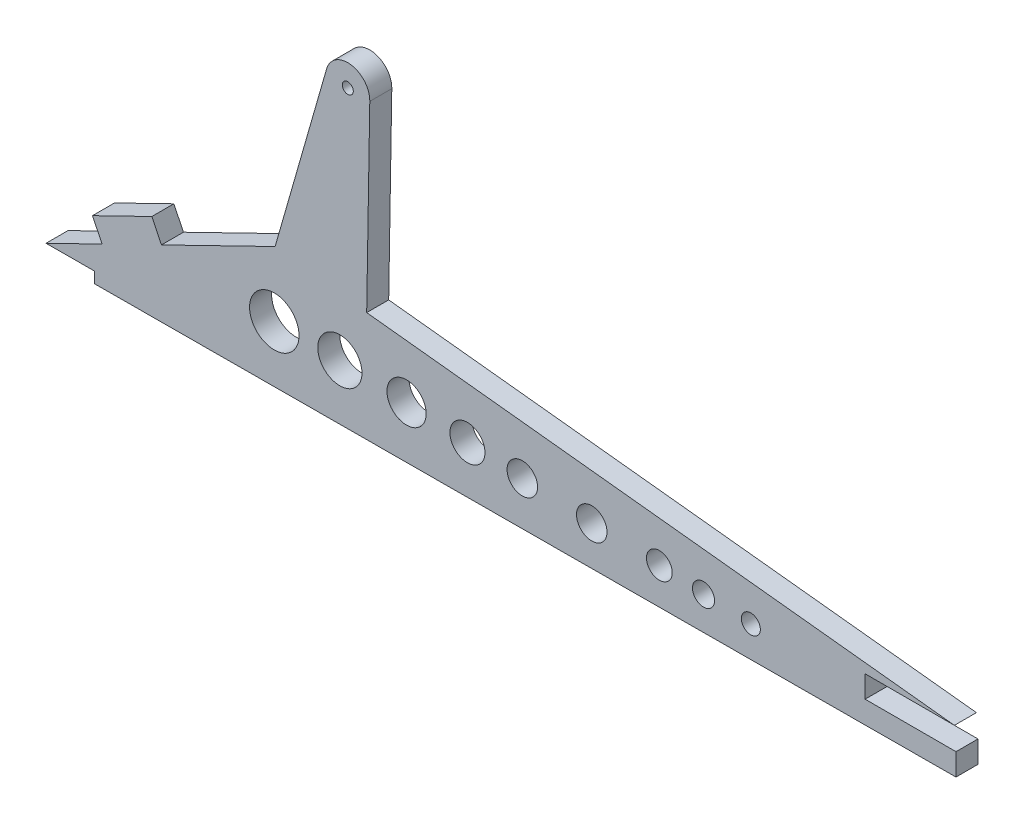
ISO-10303-21;
HEADER;
FILE_DESCRIPTION(('STEP AP214'),'2;1');
FILE_NAME('part.step','',(''),(''),'','','');
FILE_SCHEMA(('AUTOMOTIVE_DESIGN { 1 0 10303 214 1 1 1 1 }'));
ENDSEC;
DATA;
#1=APPLICATION_CONTEXT('core data for automotive mechanical design processes');
#2=APPLICATION_PROTOCOL_DEFINITION('international standard','automotive_design',2000,#1);
#3=PRODUCT_CONTEXT('',#1,'mechanical');
#4=PRODUCT('Part','Part','',(#3));
#5=PRODUCT_RELATED_PRODUCT_CATEGORY('part','',(#4));
#6=PRODUCT_DEFINITION_FORMATION('','',#4);
#7=PRODUCT_DEFINITION_CONTEXT('part definition',#1,'design');
#8=PRODUCT_DEFINITION('design','',#6,#7);
#9=PRODUCT_DEFINITION_SHAPE('','',#8);
#10=(LENGTH_UNIT() NAMED_UNIT(*) SI_UNIT(.MILLI.,.METRE.));
#11=(NAMED_UNIT(*) PLANE_ANGLE_UNIT() SI_UNIT($,.RADIAN.));
#12=(NAMED_UNIT(*) SI_UNIT($,.STERADIAN.) SOLID_ANGLE_UNIT());
#13=UNCERTAINTY_MEASURE_WITH_UNIT(LENGTH_MEASURE(1.E-05),#10,'distance_accuracy_value','');
#14=(GEOMETRIC_REPRESENTATION_CONTEXT(3) GLOBAL_UNCERTAINTY_ASSIGNED_CONTEXT((#13)) GLOBAL_UNIT_ASSIGNED_CONTEXT((#10,
#11,#12)) REPRESENTATION_CONTEXT('',''));
#15=CARTESIAN_POINT('',(0.,0.,0.));
#16=DIRECTION('',(0.,0.,1.));
#17=DIRECTION('',(1.,0.,0.));
#18=AXIS2_PLACEMENT_3D('',#15,#16,#17);
#19=CARTESIAN_POINT('',(29.3566507065568,29.7232931380651,2.));
#20=DIRECTION('',(0.,0.,1.));
#21=DIRECTION('',(1.,0.,0.));
#22=AXIS2_PLACEMENT_3D('',#19,#20,#21);
#23=PLANE('',#22);
#24=CARTESIAN_POINT('',(22.680090468022,8.02272427840867,2.));
#25=DIRECTION('',(0.,0.,1.));
#26=DIRECTION('',(1.,0.,0.));
#27=AXIS2_PLACEMENT_3D('',#24,#25,#26);
#28=CIRCLE('',#27,2.2462111920011);
#29=CARTESIAN_POINT('',(24.9263016600231,8.02272427840867,2.));
#30=VERTEX_POINT('',#29);
#31=EDGE_CURVE('E436',#30,#30,#28,.T.);
#32=ORIENTED_EDGE('',*,*,#31,.F.);
#33=EDGE_LOOP('',(#32));
#34=FACE_BOUND('',#33,.T.);
#35=CARTESIAN_POINT('',(45.2142943886309,6.94412798213639,2.));
#36=DIRECTION('',(0.,0.,1.));
#37=DIRECTION('',(1.,0.,0.));
#38=AXIS2_PLACEMENT_3D('',#35,#36,#37);
#39=CIRCLE('',#38,1.38676846513165);
#40=CARTESIAN_POINT('',(46.6010628537625,6.94412798213639,2.));
#41=VERTEX_POINT('',#40);
#42=EDGE_CURVE('E452',#41,#41,#39,.T.);
#43=ORIENTED_EDGE('',*,*,#42,.F.);
#44=EDGE_LOOP('',(#43));
#45=FACE_BOUND('',#44,.T.);
#46=CARTESIAN_POINT('',(61.6776183825757,6.04967389246499,2.));
#47=DIRECTION('',(0.,0.,1.));
#48=DIRECTION('',(1.,0.,0.));
#49=AXIS2_PLACEMENT_3D('',#46,#47,#48);
#50=CIRCLE('',#49,1.00599022067139);
#51=CARTESIAN_POINT('',(62.6836086032471,6.04967389246499,2.));
#52=VERTEX_POINT('',#51);
#53=EDGE_CURVE('E468',#52,#52,#50,.T.);
#54=ORIENTED_EDGE('',*,*,#53,.F.);
#55=EDGE_LOOP('',(#54));
#56=FACE_BOUND('',#55,.T.);
#57=CARTESIAN_POINT('',(40.2281960130975,7.26518024586645,2.));
#58=DIRECTION('',(0.,0.,1.));
#59=DIRECTION('',(1.,0.,0.));
#60=AXIS2_PLACEMENT_3D('',#57,#58,#59);
#61=CIRCLE('',#60,1.59060723683747);
#62=CARTESIAN_POINT('',(41.8188032499349,7.26518024586645,2.));
#63=VERTEX_POINT('',#62);
#64=EDGE_CURVE('E484',#63,#63,#61,.T.);
#65=ORIENTED_EDGE('',*,*,#64,.F.);
#66=EDGE_LOOP('',(#65));
#67=FACE_BOUND('',#66,.T.);
#68=CARTESIAN_POINT('',(29.3566507065568,29.7232931380651,2.));
#69=DIRECTION('',(0.,0.,1.));
#70=DIRECTION('',(1.,0.,0.));
#71=AXIS2_PLACEMENT_3D('',#68,#69,#70);
#72=CIRCLE('',#71,0.5);
#73=CARTESIAN_POINT('',(29.8566507065568,29.7232931380651,2.));
#74=VERTEX_POINT('',#73);
#75=EDGE_CURVE('E200',#74,#74,#72,.T.);
#76=ORIENTED_EDGE('',*,*,#75,.F.);
#77=EDGE_LOOP('',(#76));
#78=FACE_BOUND('',#77,.T.);
#79=CARTESIAN_POINT('',(29.3566507065568,29.7232931380651,2.));
#80=DIRECTION('',(0.,0.,1.));
#81=DIRECTION('',(1.,0.,0.));
#82=AXIS2_PLACEMENT_3D('',#79,#80,#81);
#83=CIRCLE('',#82,2.);
#84=CARTESIAN_POINT('',(31.3560328855275,29.6735849655517,2.));
#85=VERTEX_POINT('',#84);
#86=CARTESIAN_POINT('',(27.4299095256646,30.2596404339976,2.));
#87=VERTEX_POINT('',#86);
#88=EDGE_CURVE('E245',#85,#87,#83,.T.);
#89=ORIENTED_EDGE('',*,*,#88,.T.);
#90=DIRECTION('',(-0.275649217594403,-0.961258294549178,0.));
#91=VECTOR('',#90,1.);
#92=CARTESIAN_POINT('',(22.7538009631778,13.9528713412703,2.));
#93=LINE('',#92,#91);
#94=CARTESIAN_POINT('',(22.7538009631778,13.9528713412703,2.));
#95=VERTEX_POINT('',#94);
#96=EDGE_CURVE('E127',#87,#95,#93,.T.);
#97=ORIENTED_EDGE('',*,*,#96,.T.);
#98=DIRECTION('',(-0.898794046299176,-0.438371146789058,0.));
#99=VECTOR('',#98,1.);
#100=CARTESIAN_POINT('',(12.430829765545,8.91802187735826,2.));
#101=LINE('',#100,#99);
#102=CARTESIAN_POINT('',(12.430829765545,8.91802187735826,2.));
#103=VERTEX_POINT('',#102);
#104=EDGE_CURVE('E302',#95,#103,#101,.T.);
#105=ORIENTED_EDGE('',*,*,#104,.T.);
#106=DIRECTION('',(-0.438371146789109,0.898794046299152,0.));
#107=VECTOR('',#106,1.);
#108=CARTESIAN_POINT('',(11.5540874719671,10.7156099699561,2.));
#109=LINE('',#108,#107);
#110=CARTESIAN_POINT('',(11.5540874719671,10.7156099699561,2.));
#111=VERTEX_POINT('',#110);
#112=EDGE_CURVE('E322',#103,#111,#109,.T.);
#113=ORIENTED_EDGE('',*,*,#112,.T.);
#114=DIRECTION('',(-0.898794046299091,-0.438371146789234,0.));
#115=VECTOR('',#114,1.);
#116=CARTESIAN_POINT('',(6.16132319417264,8.08538308922076,2.));
#117=LINE('',#116,#115);
#118=CARTESIAN_POINT('',(6.16132319417264,8.08538308922076,2.));
#119=VERTEX_POINT('',#118);
#120=EDGE_CURVE('E318',#111,#119,#117,.T.);
#121=ORIENTED_EDGE('',*,*,#120,.T.);
#122=DIRECTION('',(0.438371146789109,-0.898794046299152,0.));
#123=VECTOR('',#122,1.);
#124=CARTESIAN_POINT('',(7.03806548775063,6.28779499662292,2.));
#125=LINE('',#124,#123);
#126=CARTESIAN_POINT('',(7.03806548775063,6.28779499662292,2.));
#127=VERTEX_POINT('',#126);
#128=EDGE_CURVE('E321',#119,#127,#125,.T.);
#129=ORIENTED_EDGE('',*,*,#128,.T.);
#130=DIRECTION('',(-0.898794046299245,-0.438371146788918,0.));
#131=VECTOR('',#130,1.);
#132=CARTESIAN_POINT('',(7.03806548775063,6.28779499662292,2.));
#133=LINE('',#132,#131);
#134=CARTESIAN_POINT('',(1.93929674249992,3.8009593180042,2.));
#135=VERTEX_POINT('',#134);
#136=EDGE_CURVE('E326',#127,#135,#133,.T.);
#137=ORIENTED_EDGE('',*,*,#136,.T.);
#138=DIRECTION('',(0.999991711061757,0.00407158541353285,0.));
#139=VECTOR('',#138,1.);
#140=CARTESIAN_POINT('',(1.93929674249992,3.8009593180042,2.));
#141=LINE('',#140,#139);
#142=CARTESIAN_POINT('',(6.36396809005763,3.8189748946526,2.));
#143=VERTEX_POINT('',#142);
#144=EDGE_CURVE('E333',#135,#143,#141,.T.);
#145=ORIENTED_EDGE('',*,*,#144,.T.);
#146=DIRECTION('',(0.00407158541473264,-0.999991711061752,0.));
#147=VECTOR('',#146,1.);
#148=CARTESIAN_POINT('',(6.36803967547237,2.81898318358677,2.));
#149=LINE('',#148,#147);
#150=CARTESIAN_POINT('',(6.36803967547237,2.81898318358677,2.));
#151=VERTEX_POINT('',#150);
#152=EDGE_CURVE('E336',#143,#151,#149,.T.);
#153=ORIENTED_EDGE('',*,*,#152,.T.);
#154=DIRECTION('',(0.999991711061761,0.00407158541259965,0.));
#155=VECTOR('',#154,1.);
#156=CARTESIAN_POINT('',(6.36803967547237,2.81898318358677,2.));
#157=LINE('',#156,#155);
#158=CARTESIAN_POINT('',(39.0801286322619,2.95217435181226,2.));
#159=VERTEX_POINT('',#158);
#160=EDGE_CURVE('E339',#151,#159,#157,.T.);
#161=ORIENTED_EDGE('',*,*,#160,.T.);
#162=DIRECTION('',(0.99999161470575,0.00409518231421341,0.));
#163=VECTOR('',#162,1.);
#164=CARTESIAN_POINT('',(39.0801286322619,2.95217435181226,2.));
#165=LINE('',#164,#163);
#166=CARTESIAN_POINT('',(84.6131730240047,3.138642033504,2.));
#167=VERTEX_POINT('',#166);
#168=EDGE_CURVE('E342',#159,#167,#165,.T.);
#169=ORIENTED_EDGE('',*,*,#168,.T.);
#170=DIRECTION('',(0.,1.,0.));
#171=VECTOR('',#170,1.);
#172=CARTESIAN_POINT('',(84.6131730240047,3.138642033504,2.));
#173=LINE('',#172,#171);
#174=CARTESIAN_POINT('',(84.6131730240047,5.13864203350491,2.));
#175=VERTEX_POINT('',#174);
#176=EDGE_CURVE('E345',#167,#175,#173,.T.);
#177=ORIENTED_EDGE('',*,*,#176,.T.);
#178=DIRECTION('',(-1.,0.,0.));
#179=VECTOR('',#178,1.);
#180=CARTESIAN_POINT('',(76.3569966280118,5.13864203350536,2.));
#181=LINE('',#180,#179);
#182=CARTESIAN_POINT('',(76.3569966280118,5.13864203350536,2.));
#183=VERTEX_POINT('',#182);
#184=EDGE_CURVE('E348',#175,#183,#181,.T.);
#185=ORIENTED_EDGE('',*,*,#184,.T.);
#186=DIRECTION('',(0.,1.,0.));
#187=VECTOR('',#186,1.);
#188=CARTESIAN_POINT('',(76.3569966280118,5.13864203350536,2.));
#189=LINE('',#188,#187);
#190=CARTESIAN_POINT('',(76.3569966280118,7.13864203350491,2.));
#191=VERTEX_POINT('',#190);
#192=EDGE_CURVE('E173',#183,#191,#189,.T.);
#193=ORIENTED_EDGE('',*,*,#192,.T.);
#194=DIRECTION('',(1.,0.,0.));
#195=VECTOR('',#194,1.);
#196=CARTESIAN_POINT('',(76.3569966280118,7.13864203350491,2.));
#197=LINE('',#196,#195);
#198=CARTESIAN_POINT('',(84.4693771304381,7.13864203350536,2.));
#199=VERTEX_POINT('',#198);
#200=EDGE_CURVE('E167',#191,#199,#197,.T.);
#201=ORIENTED_EDGE('',*,*,#200,.T.);
#202=DIRECTION('',(-0.994202761466386,0.107521482005288,0.));
#203=VECTOR('',#202,1.);
#204=CARTESIAN_POINT('',(31.0738545443462,12.9132847355992,2.));
#205=LINE('',#204,#203);
#206=CARTESIAN_POINT('',(31.0738545443462,12.9132847355992,2.));
#207=VERTEX_POINT('',#206);
#208=EDGE_CURVE('E171',#199,#207,#205,.T.);
#209=ORIENTED_EDGE('',*,*,#208,.T.);
#210=DIRECTION('',(0.0168337293134628,0.999858302739644,0.));
#211=VECTOR('',#210,1.);
#212=CARTESIAN_POINT('',(31.3560328855275,29.6735849655517,2.));
#213=LINE('',#212,#211);
#214=EDGE_CURVE('E57',#207,#85,#213,.T.);
#215=ORIENTED_EDGE('',*,*,#214,.T.);
#216=EDGE_LOOP('',(#89,#97,#105,#113,#121,#129,#137,#145,#153,#161,#169,#177,#185,#193,#201,
#209,#215));
#217=FACE_BOUND('',#216,.T.);
#218=CARTESIAN_POINT('',(34.6975794385478,7.65446375504521,2.));
#219=DIRECTION('',(0.,0.,1.));
#220=DIRECTION('',(1.,0.,0.));
#221=AXIS2_PLACEMENT_3D('',#218,#219,#220);
#222=CIRCLE('',#221,1.78299202291938);
#223=CARTESIAN_POINT('',(36.4805714614672,7.65446375504521,2.));
#224=VERTEX_POINT('',#223);
#225=EDGE_CURVE('E492',#224,#224,#222,.T.);
#226=ORIENTED_EDGE('',*,*,#225,.F.);
#227=EDGE_LOOP('',(#226));
#228=FACE_BOUND('',#227,.T.);
#229=CARTESIAN_POINT('',(57.6624037134186,6.32303913357205,2.));
#230=DIRECTION('',(0.,0.,1.));
#231=DIRECTION('',(1.,0.,0.));
#232=AXIS2_PLACEMENT_3D('',#229,#230,#231);
#233=CIRCLE('',#232,1.1683219263401);
#234=CARTESIAN_POINT('',(58.8307256397587,6.32303913357205,2.));
#235=VERTEX_POINT('',#234);
#236=EDGE_CURVE('E476',#235,#235,#233,.T.);
#237=ORIENTED_EDGE('',*,*,#236,.F.);
#238=EDGE_LOOP('',(#237));
#239=FACE_BOUND('',#238,.T.);
#240=CARTESIAN_POINT('',(65.9754176598451,5.87047321346441,2.));
#241=DIRECTION('',(0.,0.,1.));
#242=DIRECTION('',(1.,0.,0.));
#243=AXIS2_PLACEMENT_3D('',#240,#241,#242);
#244=CIRCLE('',#243,0.862372677728845);
#245=CARTESIAN_POINT('',(66.837790337574,5.87047321346441,2.));
#246=VERTEX_POINT('',#245);
#247=EDGE_CURVE('E460',#246,#246,#244,.T.);
#248=ORIENTED_EDGE('',*,*,#247,.F.);
#249=EDGE_LOOP('',(#248));
#250=FACE_BOUND('',#249,.T.);
#251=CARTESIAN_POINT('',(28.6361522127461,7.94352555744459,2.));
#252=DIRECTION('',(0.,0.,1.));
#253=DIRECTION('',(1.,0.,0.));
#254=AXIS2_PLACEMENT_3D('',#251,#252,#253);
#255=CIRCLE('',#254,2.00769198162189);
#256=CARTESIAN_POINT('',(30.643844194368,7.94352555744459,2.));
#257=VERTEX_POINT('',#256);
#258=EDGE_CURVE('E444',#257,#257,#255,.T.);
#259=ORIENTED_EDGE('',*,*,#258,.F.);
#260=EDGE_LOOP('',(#259));
#261=FACE_BOUND('',#260,.T.);
#262=CARTESIAN_POINT('',(51.5237527321467,6.55690835698775,2.));
#263=DIRECTION('',(0.,0.,1.));
#264=DIRECTION('',(1.,0.,0.));
#265=AXIS2_PLACEMENT_3D('',#262,#263,#264);
#266=CIRCLE('',#265,1.38676846513165);
#267=CARTESIAN_POINT('',(52.9105211972784,6.55690835698775,2.));
#268=VERTEX_POINT('',#267);
#269=EDGE_CURVE('E425',#268,#268,#266,.T.);
#270=ORIENTED_EDGE('',*,*,#269,.F.);
#271=EDGE_LOOP('',(#270));
#272=FACE_BOUND('',#271,.T.);
#273=ADVANCED_FACE('F39',(#34,#45,#56,#67,#78,#217,#228,#239,#250,#261,#272),#23,.T.);
#274=CARTESIAN_POINT('',(29.3566507065568,29.7232931380651,0.));
#275=DIRECTION('',(0.,0.,1.));
#276=DIRECTION('',(1.,0.,0.));
#277=AXIS2_PLACEMENT_3D('',#274,#275,#276);
#278=PLANE('',#277);
#279=CARTESIAN_POINT('',(29.3566507065568,29.7232931380651,0.));
#280=DIRECTION('',(0.,0.,1.));
#281=DIRECTION('',(1.,0.,0.));
#282=AXIS2_PLACEMENT_3D('',#279,#280,#281);
#283=CIRCLE('',#282,2.);
#284=CARTESIAN_POINT('',(31.3560328855275,29.6735849655517,0.));
#285=VERTEX_POINT('',#284);
#286=CARTESIAN_POINT('',(27.4299095256646,30.2596404339976,0.));
#287=VERTEX_POINT('',#286);
#288=EDGE_CURVE('E195',#285,#287,#283,.T.);
#289=ORIENTED_EDGE('',*,*,#288,.F.);
#290=DIRECTION('',(0.0168337293134628,0.999858302739644,0.));
#291=VECTOR('',#290,1.);
#292=CARTESIAN_POINT('',(31.3560328855275,29.6735849655517,0.));
#293=LINE('',#292,#291);
#294=CARTESIAN_POINT('',(31.0738545443462,12.9132847355992,0.));
#295=VERTEX_POINT('',#294);
#296=EDGE_CURVE('E119',#295,#285,#293,.T.);
#297=ORIENTED_EDGE('',*,*,#296,.F.);
#298=DIRECTION('',(-0.994202761466386,0.107521482005288,0.));
#299=VECTOR('',#298,1.);
#300=CARTESIAN_POINT('',(31.0738545443462,12.9132847355992,0.));
#301=LINE('',#300,#299);
#302=CARTESIAN_POINT('',(84.4693771304381,7.13864203350536,0.));
#303=VERTEX_POINT('',#302);
#304=EDGE_CURVE('E113',#303,#295,#301,.T.);
#305=ORIENTED_EDGE('',*,*,#304,.F.);
#306=DIRECTION('',(1.,0.,0.));
#307=VECTOR('',#306,1.);
#308=CARTESIAN_POINT('',(76.3569966280118,7.13864203350491,0.));
#309=LINE('',#308,#307);
#310=CARTESIAN_POINT('',(76.3569966280118,7.13864203350491,0.));
#311=VERTEX_POINT('',#310);
#312=EDGE_CURVE('E182',#311,#303,#309,.T.);
#313=ORIENTED_EDGE('',*,*,#312,.F.);
#314=DIRECTION('',(0.,1.,0.));
#315=VECTOR('',#314,1.);
#316=CARTESIAN_POINT('',(76.3569966280118,5.13864203350536,0.));
#317=LINE('',#316,#315);
#318=CARTESIAN_POINT('',(76.3569966280118,5.13864203350536,0.));
#319=VERTEX_POINT('',#318);
#320=EDGE_CURVE('E236',#319,#311,#317,.T.);
#321=ORIENTED_EDGE('',*,*,#320,.F.);
#322=DIRECTION('',(-1.,0.,0.));
#323=VECTOR('',#322,1.);
#324=CARTESIAN_POINT('',(76.3569966280118,5.13864203350536,0.));
#325=LINE('',#324,#323);
#326=CARTESIAN_POINT('',(84.6131730240047,5.13864203350491,0.));
#327=VERTEX_POINT('',#326);
#328=EDGE_CURVE('E233',#327,#319,#325,.T.);
#329=ORIENTED_EDGE('',*,*,#328,.F.);
#330=DIRECTION('',(0.,1.,0.));
#331=VECTOR('',#330,1.);
#332=CARTESIAN_POINT('',(84.6131730240047,3.138642033504,0.));
#333=LINE('',#332,#331);
#334=CARTESIAN_POINT('',(84.6131730240047,3.138642033504,0.));
#335=VERTEX_POINT('',#334);
#336=EDGE_CURVE('E230',#335,#327,#333,.T.);
#337=ORIENTED_EDGE('',*,*,#336,.F.);
#338=DIRECTION('',(0.99999161470575,0.00409518231421341,0.));
#339=VECTOR('',#338,1.);
#340=CARTESIAN_POINT('',(39.0801286322619,2.95217435181226,0.));
#341=LINE('',#340,#339);
#342=CARTESIAN_POINT('',(39.0801286322619,2.95217435181226,0.));
#343=VERTEX_POINT('',#342);
#344=EDGE_CURVE('E227',#343,#335,#341,.T.);
#345=ORIENTED_EDGE('',*,*,#344,.F.);
#346=DIRECTION('',(0.999991711061761,0.00407158541259965,0.));
#347=VECTOR('',#346,1.);
#348=CARTESIAN_POINT('',(6.36803967547237,2.81898318358677,0.));
#349=LINE('',#348,#347);
#350=CARTESIAN_POINT('',(6.36803967547237,2.81898318358677,0.));
#351=VERTEX_POINT('',#350);
#352=EDGE_CURVE('E224',#351,#343,#349,.T.);
#353=ORIENTED_EDGE('',*,*,#352,.F.);
#354=DIRECTION('',(0.00407158541473264,-0.999991711061752,0.));
#355=VECTOR('',#354,1.);
#356=CARTESIAN_POINT('',(6.36803967547237,2.81898318358677,0.));
#357=LINE('',#356,#355);
#358=CARTESIAN_POINT('',(6.36396809005763,3.8189748946526,0.));
#359=VERTEX_POINT('',#358);
#360=EDGE_CURVE('E221',#359,#351,#357,.T.);
#361=ORIENTED_EDGE('',*,*,#360,.F.);
#362=DIRECTION('',(0.999991711061757,0.00407158541353285,0.));
#363=VECTOR('',#362,1.);
#364=CARTESIAN_POINT('',(1.93929674249992,3.8009593180042,0.));
#365=LINE('',#364,#363);
#366=CARTESIAN_POINT('',(1.93929674249992,3.8009593180042,0.));
#367=VERTEX_POINT('',#366);
#368=EDGE_CURVE('E218',#367,#359,#365,.T.);
#369=ORIENTED_EDGE('',*,*,#368,.F.);
#370=DIRECTION('',(-0.898794046299245,-0.438371146788918,0.));
#371=VECTOR('',#370,1.);
#372=CARTESIAN_POINT('',(7.03806548775063,6.28779499662292,0.));
#373=LINE('',#372,#371);
#374=CARTESIAN_POINT('',(7.03806548775063,6.28779499662292,0.));
#375=VERTEX_POINT('',#374);
#376=EDGE_CURVE('E215',#375,#367,#373,.T.);
#377=ORIENTED_EDGE('',*,*,#376,.F.);
#378=DIRECTION('',(0.438371146789109,-0.898794046299152,0.));
#379=VECTOR('',#378,1.);
#380=CARTESIAN_POINT('',(7.03806548775063,6.28779499662292,0.));
#381=LINE('',#380,#379);
#382=CARTESIAN_POINT('',(6.16132319417264,8.08538308922076,0.));
#383=VERTEX_POINT('',#382);
#384=EDGE_CURVE('E212',#383,#375,#381,.T.);
#385=ORIENTED_EDGE('',*,*,#384,.F.);
#386=DIRECTION('',(-0.898794046299091,-0.438371146789234,0.));
#387=VECTOR('',#386,1.);
#388=CARTESIAN_POINT('',(6.16132319417264,8.08538308922076,0.));
#389=LINE('',#388,#387);
#390=CARTESIAN_POINT('',(11.5540874719671,10.7156099699561,0.));
#391=VERTEX_POINT('',#390);
#392=EDGE_CURVE('E209',#391,#383,#389,.T.);
#393=ORIENTED_EDGE('',*,*,#392,.F.);
#394=DIRECTION('',(-0.438371146789109,0.898794046299152,0.));
#395=VECTOR('',#394,1.);
#396=CARTESIAN_POINT('',(11.5540874719671,10.7156099699561,0.));
#397=LINE('',#396,#395);
#398=CARTESIAN_POINT('',(12.430829765545,8.91802187735826,0.));
#399=VERTEX_POINT('',#398);
#400=EDGE_CURVE('E206',#399,#391,#397,.T.);
#401=ORIENTED_EDGE('',*,*,#400,.F.);
#402=DIRECTION('',(-0.898794046299176,-0.438371146789058,0.));
#403=VECTOR('',#402,1.);
#404=CARTESIAN_POINT('',(12.430829765545,8.91802187735826,0.));
#405=LINE('',#404,#403);
#406=CARTESIAN_POINT('',(22.7538009631778,13.9528713412703,0.));
#407=VERTEX_POINT('',#406);
#408=EDGE_CURVE('E203',#407,#399,#405,.T.);
#409=ORIENTED_EDGE('',*,*,#408,.F.);
#410=DIRECTION('',(-0.275649217594403,-0.961258294549178,0.));
#411=VECTOR('',#410,1.);
#412=CARTESIAN_POINT('',(22.7538009631778,13.9528713412703,0.));
#413=LINE('',#412,#411);
#414=EDGE_CURVE('E199',#287,#407,#413,.T.);
#415=ORIENTED_EDGE('',*,*,#414,.F.);
#416=EDGE_LOOP('',(#289,#297,#305,#313,#321,#329,#337,#345,#353,#361,#369,#377,#385,#393,#401,
#409,#415));
#417=FACE_BOUND('',#416,.T.);
#418=CARTESIAN_POINT('',(29.3566507065568,29.7232931380651,0.));
#419=DIRECTION('',(0.,0.,1.));
#420=DIRECTION('',(1.,0.,0.));
#421=AXIS2_PLACEMENT_3D('',#418,#419,#420);
#422=CIRCLE('',#421,0.5);
#423=CARTESIAN_POINT('',(29.8566507065568,29.7232931380651,0.));
#424=VERTEX_POINT('',#423);
#425=EDGE_CURVE('E496',#424,#424,#422,.T.);
#426=ORIENTED_EDGE('',*,*,#425,.T.);
#427=EDGE_LOOP('',(#426));
#428=FACE_BOUND('',#427,.T.);
#429=CARTESIAN_POINT('',(34.6975794385478,7.65446375504521,0.));
#430=DIRECTION('',(0.,0.,1.));
#431=DIRECTION('',(1.,0.,0.));
#432=AXIS2_PLACEMENT_3D('',#429,#430,#431);
#433=CIRCLE('',#432,1.78299202291938);
#434=CARTESIAN_POINT('',(36.4805714614672,7.65446375504521,0.));
#435=VERTEX_POINT('',#434);
#436=EDGE_CURVE('E488',#435,#435,#433,.T.);
#437=ORIENTED_EDGE('',*,*,#436,.T.);
#438=EDGE_LOOP('',(#437));
#439=FACE_BOUND('',#438,.T.);
#440=CARTESIAN_POINT('',(40.2281960130975,7.26518024586645,0.));
#441=DIRECTION('',(0.,0.,1.));
#442=DIRECTION('',(1.,0.,0.));
#443=AXIS2_PLACEMENT_3D('',#440,#441,#442);
#444=CIRCLE('',#443,1.59060723683747);
#445=CARTESIAN_POINT('',(41.8188032499349,7.26518024586645,0.));
#446=VERTEX_POINT('',#445);
#447=EDGE_CURVE('E480',#446,#446,#444,.T.);
#448=ORIENTED_EDGE('',*,*,#447,.T.);
#449=EDGE_LOOP('',(#448));
#450=FACE_BOUND('',#449,.T.);
#451=CARTESIAN_POINT('',(57.6624037134186,6.32303913357205,0.));
#452=DIRECTION('',(0.,0.,1.));
#453=DIRECTION('',(1.,0.,0.));
#454=AXIS2_PLACEMENT_3D('',#451,#452,#453);
#455=CIRCLE('',#454,1.1683219263401);
#456=CARTESIAN_POINT('',(58.8307256397587,6.32303913357205,0.));
#457=VERTEX_POINT('',#456);
#458=EDGE_CURVE('E472',#457,#457,#455,.T.);
#459=ORIENTED_EDGE('',*,*,#458,.T.);
#460=EDGE_LOOP('',(#459));
#461=FACE_BOUND('',#460,.T.);
#462=CARTESIAN_POINT('',(61.6776183825757,6.04967389246499,0.));
#463=DIRECTION('',(0.,0.,1.));
#464=DIRECTION('',(1.,0.,0.));
#465=AXIS2_PLACEMENT_3D('',#462,#463,#464);
#466=CIRCLE('',#465,1.00599022067139);
#467=CARTESIAN_POINT('',(62.6836086032471,6.04967389246499,0.));
#468=VERTEX_POINT('',#467);
#469=EDGE_CURVE('E464',#468,#468,#466,.T.);
#470=ORIENTED_EDGE('',*,*,#469,.T.);
#471=EDGE_LOOP('',(#470));
#472=FACE_BOUND('',#471,.T.);
#473=CARTESIAN_POINT('',(65.9754176598451,5.87047321346441,0.));
#474=DIRECTION('',(0.,0.,1.));
#475=DIRECTION('',(1.,0.,0.));
#476=AXIS2_PLACEMENT_3D('',#473,#474,#475);
#477=CIRCLE('',#476,0.862372677728845);
#478=CARTESIAN_POINT('',(66.837790337574,5.87047321346441,0.));
#479=VERTEX_POINT('',#478);
#480=EDGE_CURVE('E456',#479,#479,#477,.T.);
#481=ORIENTED_EDGE('',*,*,#480,.T.);
#482=EDGE_LOOP('',(#481));
#483=FACE_BOUND('',#482,.T.);
#484=CARTESIAN_POINT('',(45.2142943886309,6.94412798213639,0.));
#485=DIRECTION('',(0.,0.,1.));
#486=DIRECTION('',(1.,0.,0.));
#487=AXIS2_PLACEMENT_3D('',#484,#485,#486);
#488=CIRCLE('',#487,1.38676846513165);
#489=CARTESIAN_POINT('',(46.6010628537625,6.94412798213639,0.));
#490=VERTEX_POINT('',#489);
#491=EDGE_CURVE('E448',#490,#490,#488,.T.);
#492=ORIENTED_EDGE('',*,*,#491,.T.);
#493=EDGE_LOOP('',(#492));
#494=FACE_BOUND('',#493,.T.);
#495=CARTESIAN_POINT('',(28.6361522127461,7.94352555744459,0.));
#496=DIRECTION('',(0.,0.,1.));
#497=DIRECTION('',(1.,0.,0.));
#498=AXIS2_PLACEMENT_3D('',#495,#496,#497);
#499=CIRCLE('',#498,2.00769198162189);
#500=CARTESIAN_POINT('',(30.643844194368,7.94352555744459,0.));
#501=VERTEX_POINT('',#500);
#502=EDGE_CURVE('E440',#501,#501,#499,.T.);
#503=ORIENTED_EDGE('',*,*,#502,.T.);
#504=EDGE_LOOP('',(#503));
#505=FACE_BOUND('',#504,.T.);
#506=CARTESIAN_POINT('',(22.680090468022,8.02272427840867,0.));
#507=DIRECTION('',(0.,0.,1.));
#508=DIRECTION('',(1.,0.,0.));
#509=AXIS2_PLACEMENT_3D('',#506,#507,#508);
#510=CIRCLE('',#509,2.2462111920011);
#511=CARTESIAN_POINT('',(24.9263016600231,8.02272427840867,0.));
#512=VERTEX_POINT('',#511);
#513=EDGE_CURVE('E433',#512,#512,#510,.T.);
#514=ORIENTED_EDGE('',*,*,#513,.T.);
#515=EDGE_LOOP('',(#514));
#516=FACE_BOUND('',#515,.T.);
#517=CARTESIAN_POINT('',(51.5237527321467,6.55690835698775,0.));
#518=DIRECTION('',(0.,0.,1.));
#519=DIRECTION('',(1.,0.,0.));
#520=AXIS2_PLACEMENT_3D('',#517,#518,#519);
#521=CIRCLE('',#520,1.38676846513165);
#522=CARTESIAN_POINT('',(52.9105211972784,6.55690835698775,0.));
#523=VERTEX_POINT('',#522);
#524=EDGE_CURVE('E428',#523,#523,#521,.T.);
#525=ORIENTED_EDGE('',*,*,#524,.T.);
#526=EDGE_LOOP('',(#525));
#527=FACE_BOUND('',#526,.T.);
#528=ADVANCED_FACE('F306',(#417,#428,#439,#450,#461,#472,#483,#494,#505,#516,#527),#278,.F.);
#529=CARTESIAN_POINT('',(29.3566507065568,29.7232931380651,2.));
#530=DIRECTION('',(0.,0.,-1.));
#531=DIRECTION('',(-1.,0.,0.));
#532=AXIS2_PLACEMENT_3D('',#529,#530,#531);
#533=CYLINDRICAL_SURFACE('',#532,2.);
#534=ORIENTED_EDGE('',*,*,#288,.T.);
#535=DIRECTION('',(0.,0.,-1.));
#536=VECTOR('',#535,1.);
#537=CARTESIAN_POINT('',(27.4299095256646,30.2596404339976,2.));
#538=LINE('',#537,#536);
#539=EDGE_CURVE('E11',#87,#287,#538,.T.);
#540=ORIENTED_EDGE('',*,*,#539,.F.);
#541=ORIENTED_EDGE('',*,*,#88,.F.);
#542=DIRECTION('',(0.,0.,-1.));
#543=VECTOR('',#542,1.);
#544=CARTESIAN_POINT('',(31.3560328855275,29.6735849655517,2.));
#545=LINE('',#544,#543);
#546=EDGE_CURVE('E191',#85,#285,#545,.T.);
#547=ORIENTED_EDGE('',*,*,#546,.T.);
#548=EDGE_LOOP('',(#534,#540,#541,#547));
#549=FACE_BOUND('',#548,.T.);
#550=ADVANCED_FACE('F41',(#549),#533,.T.);
#551=CARTESIAN_POINT('',(22.7538009631778,13.9528713412703,2.));
#552=DIRECTION('',(0.961258294549178,-0.275649217594403,0.));
#553=DIRECTION('',(0.275649217594403,0.961258294549178,0.));
#554=AXIS2_PLACEMENT_3D('',#551,#552,#553);
#555=PLANE('',#554);
#556=ORIENTED_EDGE('',*,*,#414,.T.);
#557=DIRECTION('',(0.,0.,-1.));
#558=VECTOR('',#557,1.);
#559=CARTESIAN_POINT('',(22.7538009631778,13.9528713412703,2.));
#560=LINE('',#559,#558);
#561=EDGE_CURVE('E49',#95,#407,#560,.T.);
#562=ORIENTED_EDGE('',*,*,#561,.F.);
#563=ORIENTED_EDGE('',*,*,#96,.F.);
#564=ORIENTED_EDGE('',*,*,#539,.T.);
#565=EDGE_LOOP('',(#556,#562,#563,#564));
#566=FACE_BOUND('',#565,.T.);
#567=ADVANCED_FACE('F716',(#566),#555,.F.);
#568=CARTESIAN_POINT('',(12.430829765545,8.91802187735826,2.));
#569=DIRECTION('',(0.438371146789058,-0.898794046299177,0.));
#570=DIRECTION('',(0.898794046299177,0.438371146789058,0.));
#571=AXIS2_PLACEMENT_3D('',#568,#569,#570);
#572=PLANE('',#571);
#573=ORIENTED_EDGE('',*,*,#408,.T.);
#574=DIRECTION('',(0.,0.,-1.));
#575=VECTOR('',#574,1.);
#576=CARTESIAN_POINT('',(12.430829765545,8.91802187735826,2.));
#577=LINE('',#576,#575);
#578=EDGE_CURVE('E292',#103,#399,#577,.T.);
#579=ORIENTED_EDGE('',*,*,#578,.F.);
#580=ORIENTED_EDGE('',*,*,#104,.F.);
#581=ORIENTED_EDGE('',*,*,#561,.T.);
#582=EDGE_LOOP('',(#573,#579,#580,#581));
#583=FACE_BOUND('',#582,.T.);
#584=ADVANCED_FACE('F300',(#583),#572,.F.);
#585=CARTESIAN_POINT('',(11.5540874719671,10.7156099699561,2.));
#586=DIRECTION('',(-0.898794046299152,-0.438371146789109,0.));
#587=DIRECTION('',(0.438371146789109,-0.898794046299152,0.));
#588=AXIS2_PLACEMENT_3D('',#585,#586,#587);
#589=PLANE('',#588);
#590=ORIENTED_EDGE('',*,*,#400,.T.);
#591=DIRECTION('',(0.,0.,-1.));
#592=VECTOR('',#591,1.);
#593=CARTESIAN_POINT('',(11.5540874719671,10.7156099699561,2.));
#594=LINE('',#593,#592);
#595=EDGE_CURVE('E288',#111,#391,#594,.T.);
#596=ORIENTED_EDGE('',*,*,#595,.F.);
#597=ORIENTED_EDGE('',*,*,#112,.F.);
#598=ORIENTED_EDGE('',*,*,#578,.T.);
#599=EDGE_LOOP('',(#590,#596,#597,#598));
#600=FACE_BOUND('',#599,.T.);
#601=ADVANCED_FACE('F312',(#600),#589,.F.);
#602=CARTESIAN_POINT('',(6.16132319417264,8.08538308922076,2.));
#603=DIRECTION('',(0.438371146789234,-0.898794046299091,0.));
#604=DIRECTION('',(0.898794046299091,0.438371146789234,0.));
#605=AXIS2_PLACEMENT_3D('',#602,#603,#604);
#606=PLANE('',#605);
#607=ORIENTED_EDGE('',*,*,#392,.T.);
#608=DIRECTION('',(0.,0.,-1.));
#609=VECTOR('',#608,1.);
#610=CARTESIAN_POINT('',(6.16132319417264,8.08538308922076,2.));
#611=LINE('',#610,#609);
#612=EDGE_CURVE('E284',#119,#383,#611,.T.);
#613=ORIENTED_EDGE('',*,*,#612,.F.);
#614=ORIENTED_EDGE('',*,*,#120,.F.);
#615=ORIENTED_EDGE('',*,*,#595,.T.);
#616=EDGE_LOOP('',(#607,#613,#614,#615));
#617=FACE_BOUND('',#616,.T.);
#618=ADVANCED_FACE('F316',(#617),#606,.F.);
#619=CARTESIAN_POINT('',(7.03806548775063,6.28779499662292,2.));
#620=DIRECTION('',(0.898794046299152,0.438371146789109,0.));
#621=DIRECTION('',(-0.438371146789109,0.898794046299152,0.));
#622=AXIS2_PLACEMENT_3D('',#619,#620,#621);
#623=PLANE('',#622);
#624=ORIENTED_EDGE('',*,*,#384,.T.);
#625=DIRECTION('',(0.,0.,-1.));
#626=VECTOR('',#625,1.);
#627=CARTESIAN_POINT('',(7.03806548775063,6.28779499662292,2.));
#628=LINE('',#627,#626);
#629=EDGE_CURVE('E280',#127,#375,#628,.T.);
#630=ORIENTED_EDGE('',*,*,#629,.F.);
#631=ORIENTED_EDGE('',*,*,#128,.F.);
#632=ORIENTED_EDGE('',*,*,#612,.T.);
#633=EDGE_LOOP('',(#624,#630,#631,#632));
#634=FACE_BOUND('',#633,.T.);
#635=ADVANCED_FACE('F681',(#634),#623,.F.);
#636=CARTESIAN_POINT('',(7.03806548775063,6.28779499662292,2.));
#637=DIRECTION('',(0.438371146788918,-0.898794046299245,0.));
#638=DIRECTION('',(0.898794046299245,0.438371146788918,0.));
#639=AXIS2_PLACEMENT_3D('',#636,#637,#638);
#640=PLANE('',#639);
#641=ORIENTED_EDGE('',*,*,#376,.T.);
#642=DIRECTION('',(0.,0.,-1.));
#643=VECTOR('',#642,1.);
#644=CARTESIAN_POINT('',(1.93929674249992,3.8009593180042,2.));
#645=LINE('',#644,#643);
#646=EDGE_CURVE('E276',#135,#367,#645,.T.);
#647=ORIENTED_EDGE('',*,*,#646,.F.);
#648=ORIENTED_EDGE('',*,*,#136,.F.);
#649=ORIENTED_EDGE('',*,*,#629,.T.);
#650=EDGE_LOOP('',(#641,#647,#648,#649));
#651=FACE_BOUND('',#650,.T.);
#652=ADVANCED_FACE('F671',(#651),#640,.F.);
#653=CARTESIAN_POINT('',(1.93929674249992,3.8009593180042,2.));
#654=DIRECTION('',(-0.00407158541353285,0.999991711061757,0.));
#655=DIRECTION('',(-0.999991711061757,-0.00407158541353285,0.));
#656=AXIS2_PLACEMENT_3D('',#653,#654,#655);
#657=PLANE('',#656);
#658=ORIENTED_EDGE('',*,*,#368,.T.);
#659=DIRECTION('',(0.,0.,-1.));
#660=VECTOR('',#659,1.);
#661=CARTESIAN_POINT('',(6.36396809005763,3.8189748946526,2.));
#662=LINE('',#661,#660);
#663=EDGE_CURVE('E272',#143,#359,#662,.T.);
#664=ORIENTED_EDGE('',*,*,#663,.F.);
#665=ORIENTED_EDGE('',*,*,#144,.F.);
#666=ORIENTED_EDGE('',*,*,#646,.T.);
#667=EDGE_LOOP('',(#658,#664,#665,#666));
#668=FACE_BOUND('',#667,.T.);
#669=ADVANCED_FACE('F661',(#668),#657,.F.);
#670=CARTESIAN_POINT('',(6.36803967547237,2.81898318358677,2.));
#671=DIRECTION('',(0.999991711061752,0.00407158541473264,0.));
#672=DIRECTION('',(-0.00407158541473264,0.999991711061752,0.));
#673=AXIS2_PLACEMENT_3D('',#670,#671,#672);
#674=PLANE('',#673);
#675=ORIENTED_EDGE('',*,*,#360,.T.);
#676=DIRECTION('',(0.,0.,-1.));
#677=VECTOR('',#676,1.);
#678=CARTESIAN_POINT('',(6.36803967547237,2.81898318358677,2.));
#679=LINE('',#678,#677);
#680=EDGE_CURVE('E268',#151,#351,#679,.T.);
#681=ORIENTED_EDGE('',*,*,#680,.F.);
#682=ORIENTED_EDGE('',*,*,#152,.F.);
#683=ORIENTED_EDGE('',*,*,#663,.T.);
#684=EDGE_LOOP('',(#675,#681,#682,#683));
#685=FACE_BOUND('',#684,.T.);
#686=ADVANCED_FACE('F651',(#685),#674,.F.);
#687=CARTESIAN_POINT('',(6.36803967547237,2.81898318358677,2.));
#688=DIRECTION('',(-0.00407158541259965,0.999991711061761,0.));
#689=DIRECTION('',(-0.999991711061761,-0.00407158541259965,0.));
#690=AXIS2_PLACEMENT_3D('',#687,#688,#689);
#691=PLANE('',#690);
#692=ORIENTED_EDGE('',*,*,#352,.T.);
#693=DIRECTION('',(0.,0.,-1.));
#694=VECTOR('',#693,1.);
#695=CARTESIAN_POINT('',(39.0801286322619,2.95217435181226,2.));
#696=LINE('',#695,#694);
#697=EDGE_CURVE('E264',#159,#343,#696,.T.);
#698=ORIENTED_EDGE('',*,*,#697,.F.);
#699=ORIENTED_EDGE('',*,*,#160,.F.);
#700=ORIENTED_EDGE('',*,*,#680,.T.);
#701=EDGE_LOOP('',(#692,#698,#699,#700));
#702=FACE_BOUND('',#701,.T.);
#703=ADVANCED_FACE('F641',(#702),#691,.F.);
#704=CARTESIAN_POINT('',(39.0801286322619,2.95217435181226,2.));
#705=DIRECTION('',(-0.00409518231421341,0.99999161470575,0.));
#706=DIRECTION('',(-0.99999161470575,-0.00409518231421341,0.));
#707=AXIS2_PLACEMENT_3D('',#704,#705,#706);
#708=PLANE('',#707);
#709=ORIENTED_EDGE('',*,*,#344,.T.);
#710=DIRECTION('',(0.,0.,-1.));
#711=VECTOR('',#710,1.);
#712=CARTESIAN_POINT('',(84.6131730240047,3.138642033504,2.));
#713=LINE('',#712,#711);
#714=EDGE_CURVE('E260',#167,#335,#713,.T.);
#715=ORIENTED_EDGE('',*,*,#714,.F.);
#716=ORIENTED_EDGE('',*,*,#168,.F.);
#717=ORIENTED_EDGE('',*,*,#697,.T.);
#718=EDGE_LOOP('',(#709,#715,#716,#717));
#719=FACE_BOUND('',#718,.T.);
#720=ADVANCED_FACE('F631',(#719),#708,.F.);
#721=CARTESIAN_POINT('',(84.6131730240047,3.138642033504,2.));
#722=DIRECTION('',(-1.,0.,0.));
#723=DIRECTION('',(0.,0.,1.));
#724=AXIS2_PLACEMENT_3D('',#721,#722,#723);
#725=PLANE('',#724);
#726=ORIENTED_EDGE('',*,*,#336,.T.);
#727=DIRECTION('',(0.,0.,-1.));
#728=VECTOR('',#727,1.);
#729=CARTESIAN_POINT('',(84.6131730240047,5.13864203350491,2.));
#730=LINE('',#729,#728);
#731=EDGE_CURVE('E256',#175,#327,#730,.T.);
#732=ORIENTED_EDGE('',*,*,#731,.F.);
#733=ORIENTED_EDGE('',*,*,#176,.F.);
#734=ORIENTED_EDGE('',*,*,#714,.T.);
#735=EDGE_LOOP('',(#726,#732,#733,#734));
#736=FACE_BOUND('',#735,.T.);
#737=ADVANCED_FACE('F622',(#736),#725,.F.);
#738=CARTESIAN_POINT('',(76.3569966280118,5.13864203350536,2.));
#739=DIRECTION('',(0.,-1.,0.));
#740=DIRECTION('',(1.,0.,0.));
#741=AXIS2_PLACEMENT_3D('',#738,#739,#740);
#742=PLANE('',#741);
#743=ORIENTED_EDGE('',*,*,#328,.T.);
#744=DIRECTION('',(0.,0.,-1.));
#745=VECTOR('',#744,1.);
#746=CARTESIAN_POINT('',(76.3569966280118,5.13864203350536,2.));
#747=LINE('',#746,#745);
#748=EDGE_CURVE('E252',#183,#319,#747,.T.);
#749=ORIENTED_EDGE('',*,*,#748,.F.);
#750=ORIENTED_EDGE('',*,*,#184,.F.);
#751=ORIENTED_EDGE('',*,*,#731,.T.);
#752=EDGE_LOOP('',(#743,#749,#750,#751));
#753=FACE_BOUND('',#752,.T.);
#754=ADVANCED_FACE('F356',(#753),#742,.F.);
#755=CARTESIAN_POINT('',(76.3569966280118,5.13864203350536,2.));
#756=DIRECTION('',(-1.,0.,0.));
#757=DIRECTION('',(0.,0.,1.));
#758=AXIS2_PLACEMENT_3D('',#755,#756,#757);
#759=PLANE('',#758);
#760=ORIENTED_EDGE('',*,*,#320,.T.);
#761=DIRECTION('',(0.,0.,-1.));
#762=VECTOR('',#761,1.);
#763=CARTESIAN_POINT('',(76.3569966280118,7.13864203350491,2.));
#764=LINE('',#763,#762);
#765=EDGE_CURVE('E184',#191,#311,#764,.T.);
#766=ORIENTED_EDGE('',*,*,#765,.F.);
#767=ORIENTED_EDGE('',*,*,#192,.F.);
#768=ORIENTED_EDGE('',*,*,#748,.T.);
#769=EDGE_LOOP('',(#760,#766,#767,#768));
#770=FACE_BOUND('',#769,.T.);
#771=ADVANCED_FACE('F360',(#770),#759,.F.);
#772=CARTESIAN_POINT('',(76.3569966280118,7.13864203350491,2.));
#773=DIRECTION('',(0.,1.,0.));
#774=DIRECTION('',(-1.,0.,0.));
#775=AXIS2_PLACEMENT_3D('',#772,#773,#774);
#776=PLANE('',#775);
#777=ORIENTED_EDGE('',*,*,#312,.T.);
#778=DIRECTION('',(0.,0.,-1.));
#779=VECTOR('',#778,1.);
#780=CARTESIAN_POINT('',(84.4693771304381,7.13864203350536,2.));
#781=LINE('',#780,#779);
#782=EDGE_CURVE('E179',#199,#303,#781,.T.);
#783=ORIENTED_EDGE('',*,*,#782,.F.);
#784=ORIENTED_EDGE('',*,*,#200,.F.);
#785=ORIENTED_EDGE('',*,*,#765,.T.);
#786=EDGE_LOOP('',(#777,#783,#784,#785));
#787=FACE_BOUND('',#786,.T.);
#788=ADVANCED_FACE('F180',(#787),#776,.F.);
#789=CARTESIAN_POINT('',(31.0738545443462,12.9132847355992,2.));
#790=DIRECTION('',(-0.107521482005288,-0.994202761466386,0.));
#791=DIRECTION('',(0.994202761466386,-0.107521482005288,0.));
#792=AXIS2_PLACEMENT_3D('',#789,#790,#791);
#793=PLANE('',#792);
#794=ORIENTED_EDGE('',*,*,#304,.T.);
#795=DIRECTION('',(0.,0.,-1.));
#796=VECTOR('',#795,1.);
#797=CARTESIAN_POINT('',(31.0738545443462,12.9132847355992,2.));
#798=LINE('',#797,#796);
#799=EDGE_CURVE('E185',#207,#295,#798,.T.);
#800=ORIENTED_EDGE('',*,*,#799,.F.);
#801=ORIENTED_EDGE('',*,*,#208,.F.);
#802=ORIENTED_EDGE('',*,*,#782,.T.);
#803=EDGE_LOOP('',(#794,#800,#801,#802));
#804=FACE_BOUND('',#803,.T.);
#805=ADVANCED_FACE('F187',(#804),#793,.F.);
#806=CARTESIAN_POINT('',(31.3560328855275,29.6735849655517,2.));
#807=DIRECTION('',(-0.999858302739644,0.0168337293134628,0.));
#808=DIRECTION('',(-0.0168337293134628,-0.999858302739644,0.));
#809=AXIS2_PLACEMENT_3D('',#806,#807,#808);
#810=PLANE('',#809);
#811=ORIENTED_EDGE('',*,*,#296,.T.);
#812=ORIENTED_EDGE('',*,*,#546,.F.);
#813=ORIENTED_EDGE('',*,*,#214,.F.);
#814=ORIENTED_EDGE('',*,*,#799,.T.);
#815=EDGE_LOOP('',(#811,#812,#813,#814));
#816=FACE_BOUND('',#815,.T.);
#817=ADVANCED_FACE('F364',(#816),#810,.F.);
#818=CARTESIAN_POINT('',(29.3566507065568,29.7232931380651,2.));
#819=DIRECTION('',(0.,0.,-1.));
#820=DIRECTION('',(-1.,0.,0.));
#821=AXIS2_PLACEMENT_3D('',#818,#819,#820);
#822=CYLINDRICAL_SURFACE('',#821,0.5);
#823=ORIENTED_EDGE('',*,*,#75,.T.);
#824=EDGE_LOOP('',(#823));
#825=FACE_BOUND('',#824,.T.);
#826=ORIENTED_EDGE('',*,*,#425,.F.);
#827=EDGE_LOOP('',(#826));
#828=FACE_BOUND('',#827,.T.);
#829=ADVANCED_FACE('F366',(#825,#828),#822,.F.);
#830=CARTESIAN_POINT('',(34.6975794385478,7.65446375504521,2.));
#831=DIRECTION('',(0.,0.,-1.));
#832=DIRECTION('',(-1.,0.,0.));
#833=AXIS2_PLACEMENT_3D('',#830,#831,#832);
#834=CYLINDRICAL_SURFACE('',#833,1.78299202291938);
#835=ORIENTED_EDGE('',*,*,#225,.T.);
#836=EDGE_LOOP('',(#835));
#837=FACE_BOUND('',#836,.T.);
#838=ORIENTED_EDGE('',*,*,#436,.F.);
#839=EDGE_LOOP('',(#838));
#840=FACE_BOUND('',#839,.T.);
#841=ADVANCED_FACE('F372',(#837,#840),#834,.F.);
#842=CARTESIAN_POINT('',(40.2281960130975,7.26518024586645,2.));
#843=DIRECTION('',(0.,0.,-1.));
#844=DIRECTION('',(-1.,0.,0.));
#845=AXIS2_PLACEMENT_3D('',#842,#843,#844);
#846=CYLINDRICAL_SURFACE('',#845,1.59060723683747);
#847=ORIENTED_EDGE('',*,*,#64,.T.);
#848=EDGE_LOOP('',(#847));
#849=FACE_BOUND('',#848,.T.);
#850=ORIENTED_EDGE('',*,*,#447,.F.);
#851=EDGE_LOOP('',(#850));
#852=FACE_BOUND('',#851,.T.);
#853=ADVANCED_FACE('F388',(#849,#852),#846,.F.);
#854=CARTESIAN_POINT('',(57.6624037134186,6.32303913357205,2.));
#855=DIRECTION('',(0.,0.,-1.));
#856=DIRECTION('',(-1.,0.,0.));
#857=AXIS2_PLACEMENT_3D('',#854,#855,#856);
#858=CYLINDRICAL_SURFACE('',#857,1.1683219263401);
#859=ORIENTED_EDGE('',*,*,#236,.T.);
#860=EDGE_LOOP('',(#859));
#861=FACE_BOUND('',#860,.T.);
#862=ORIENTED_EDGE('',*,*,#458,.F.);
#863=EDGE_LOOP('',(#862));
#864=FACE_BOUND('',#863,.T.);
#865=ADVANCED_FACE('F392',(#861,#864),#858,.F.);
#866=CARTESIAN_POINT('',(61.6776183825757,6.04967389246499,2.));
#867=DIRECTION('',(0.,0.,-1.));
#868=DIRECTION('',(-1.,0.,0.));
#869=AXIS2_PLACEMENT_3D('',#866,#867,#868);
#870=CYLINDRICAL_SURFACE('',#869,1.00599022067139);
#871=ORIENTED_EDGE('',*,*,#53,.T.);
#872=EDGE_LOOP('',(#871));
#873=FACE_BOUND('',#872,.T.);
#874=ORIENTED_EDGE('',*,*,#469,.F.);
#875=EDGE_LOOP('',(#874));
#876=FACE_BOUND('',#875,.T.);
#877=ADVANCED_FACE('F396',(#873,#876),#870,.F.);
#878=CARTESIAN_POINT('',(65.9754176598451,5.87047321346441,2.));
#879=DIRECTION('',(0.,0.,-1.));
#880=DIRECTION('',(-1.,0.,0.));
#881=AXIS2_PLACEMENT_3D('',#878,#879,#880);
#882=CYLINDRICAL_SURFACE('',#881,0.862372677728845);
#883=ORIENTED_EDGE('',*,*,#247,.T.);
#884=EDGE_LOOP('',(#883));
#885=FACE_BOUND('',#884,.T.);
#886=ORIENTED_EDGE('',*,*,#480,.F.);
#887=EDGE_LOOP('',(#886));
#888=FACE_BOUND('',#887,.T.);
#889=ADVANCED_FACE('F400',(#885,#888),#882,.F.);
#890=CARTESIAN_POINT('',(45.2142943886309,6.94412798213639,2.));
#891=DIRECTION('',(0.,0.,-1.));
#892=DIRECTION('',(-1.,0.,0.));
#893=AXIS2_PLACEMENT_3D('',#890,#891,#892);
#894=CYLINDRICAL_SURFACE('',#893,1.38676846513165);
#895=ORIENTED_EDGE('',*,*,#42,.T.);
#896=EDGE_LOOP('',(#895));
#897=FACE_BOUND('',#896,.T.);
#898=ORIENTED_EDGE('',*,*,#491,.F.);
#899=EDGE_LOOP('',(#898));
#900=FACE_BOUND('',#899,.T.);
#901=ADVANCED_FACE('F404',(#897,#900),#894,.F.);
#902=CARTESIAN_POINT('',(28.6361522127461,7.94352555744459,2.));
#903=DIRECTION('',(0.,0.,-1.));
#904=DIRECTION('',(-1.,0.,0.));
#905=AXIS2_PLACEMENT_3D('',#902,#903,#904);
#906=CYLINDRICAL_SURFACE('',#905,2.00769198162189);
#907=ORIENTED_EDGE('',*,*,#258,.T.);
#908=EDGE_LOOP('',(#907));
#909=FACE_BOUND('',#908,.T.);
#910=ORIENTED_EDGE('',*,*,#502,.F.);
#911=EDGE_LOOP('',(#910));
#912=FACE_BOUND('',#911,.T.);
#913=ADVANCED_FACE('F408',(#909,#912),#906,.F.);
#914=CARTESIAN_POINT('',(22.680090468022,8.02272427840867,2.));
#915=DIRECTION('',(0.,0.,-1.));
#916=DIRECTION('',(-1.,0.,0.));
#917=AXIS2_PLACEMENT_3D('',#914,#915,#916);
#918=CYLINDRICAL_SURFACE('',#917,2.2462111920011);
#919=ORIENTED_EDGE('',*,*,#31,.T.);
#920=EDGE_LOOP('',(#919));
#921=FACE_BOUND('',#920,.T.);
#922=ORIENTED_EDGE('',*,*,#513,.F.);
#923=EDGE_LOOP('',(#922));
#924=FACE_BOUND('',#923,.T.);
#925=ADVANCED_FACE('F412',(#921,#924),#918,.F.);
#926=CARTESIAN_POINT('',(51.5237527321467,6.55690835698775,2.));
#927=DIRECTION('',(0.,0.,-1.));
#928=DIRECTION('',(-1.,0.,0.));
#929=AXIS2_PLACEMENT_3D('',#926,#927,#928);
#930=CYLINDRICAL_SURFACE('',#929,1.38676846513165);
#931=ORIENTED_EDGE('',*,*,#269,.T.);
#932=EDGE_LOOP('',(#931));
#933=FACE_BOUND('',#932,.T.);
#934=ORIENTED_EDGE('',*,*,#524,.F.);
#935=EDGE_LOOP('',(#934));
#936=FACE_BOUND('',#935,.T.);
#937=ADVANCED_FACE('F416',(#933,#936),#930,.F.);
#938=CLOSED_SHELL('',(#273,#528,#550,#567,#584,#601,#618,#635,#652,#669,#686,#703,#720,#737,
#754,#771,#788,#805,#817,#829,#841,#853,#865,#877,#889,#901,#913,#925,#937));
#939=MANIFOLD_SOLID_BREP('B2',#938);
#940=ADVANCED_BREP_SHAPE_REPRESENTATION('',(#18,#939),#14);
#941=SHAPE_DEFINITION_REPRESENTATION(#9,#940);
ENDSEC;
END-ISO-10303-21;
